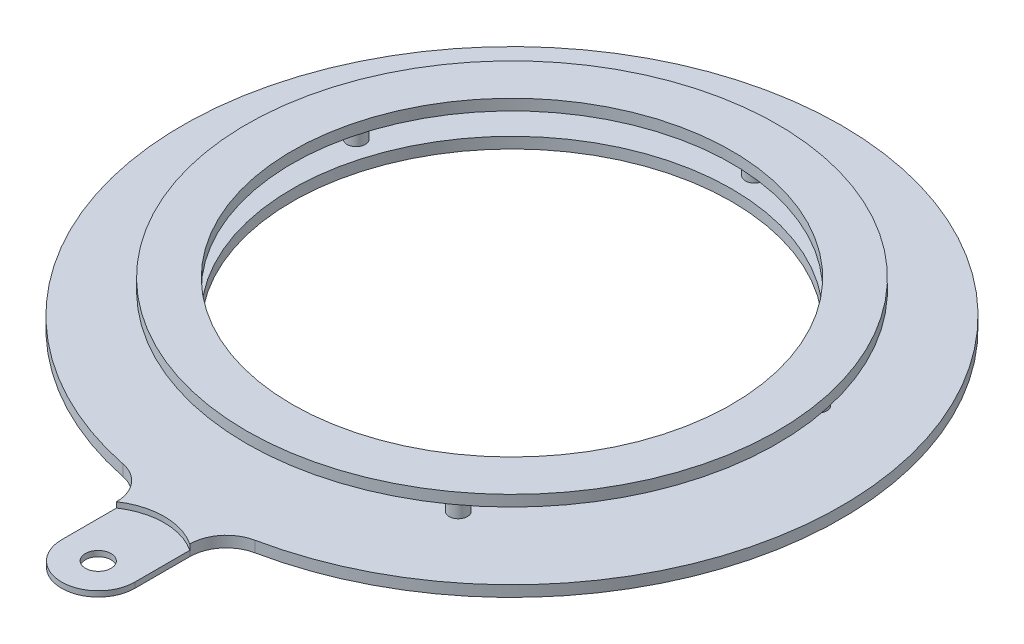
ISO-10303-21;
HEADER;
FILE_DESCRIPTION(('STEP AP214'),'2;1');
FILE_NAME('part.step','',(''),(''),'','','');
FILE_SCHEMA(('AUTOMOTIVE_DESIGN { 1 0 10303 214 1 1 1 1 }'));
ENDSEC;
DATA;
#1=APPLICATION_CONTEXT('core data for automotive mechanical design processes');
#2=APPLICATION_PROTOCOL_DEFINITION('international standard','automotive_design',2000,#1);
#3=PRODUCT_CONTEXT('',#1,'mechanical');
#4=PRODUCT('Part','Part','',(#3));
#5=PRODUCT_RELATED_PRODUCT_CATEGORY('part','',(#4));
#6=PRODUCT_DEFINITION_FORMATION('','',#4);
#7=PRODUCT_DEFINITION_CONTEXT('part definition',#1,'design');
#8=PRODUCT_DEFINITION('design','',#6,#7);
#9=PRODUCT_DEFINITION_SHAPE('','',#8);
#10=(LENGTH_UNIT() NAMED_UNIT(*) SI_UNIT(.MILLI.,.METRE.));
#11=(NAMED_UNIT(*) PLANE_ANGLE_UNIT() SI_UNIT($,.RADIAN.));
#12=(NAMED_UNIT(*) SI_UNIT($,.STERADIAN.) SOLID_ANGLE_UNIT());
#13=UNCERTAINTY_MEASURE_WITH_UNIT(LENGTH_MEASURE(1.E-05),#10,'distance_accuracy_value','');
#14=(GEOMETRIC_REPRESENTATION_CONTEXT(3) GLOBAL_UNCERTAINTY_ASSIGNED_CONTEXT((#13)) GLOBAL_UNIT_ASSIGNED_CONTEXT((#10,
#11,#12)) REPRESENTATION_CONTEXT('',''));
#15=CARTESIAN_POINT('',(0.,0.,0.));
#16=DIRECTION('',(0.,0.,1.));
#17=DIRECTION('',(1.,0.,0.));
#18=AXIS2_PLACEMENT_3D('',#15,#16,#17);
#19=CARTESIAN_POINT('',(0.,-9.,112.979589711327));
#20=DIRECTION('',(0.,1.,0.));
#21=DIRECTION('',(0.,0.,1.));
#22=AXIS2_PLACEMENT_3D('',#19,#20,#21);
#23=CYLINDRICAL_SURFACE('',#22,10.);
#24=CARTESIAN_POINT('',(0.,-7.5,112.979589711327));
#25=DIRECTION('',(0.,1.,0.));
#26=DIRECTION('',(0.,0.,1.));
#27=AXIS2_PLACEMENT_3D('',#24,#25,#26);
#28=CIRCLE('',#27,10.);
#29=CARTESIAN_POINT('',(-10.,-7.5,112.979589711327));
#30=VERTEX_POINT('',#29);
#31=CARTESIAN_POINT('',(10.,-7.5,112.979589711327));
#32=VERTEX_POINT('',#31);
#33=EDGE_CURVE('E55',#30,#32,#28,.T.);
#34=ORIENTED_EDGE('',*,*,#33,.F.);
#35=DIRECTION('',(0.,1.,0.));
#36=VECTOR('',#35,1.);
#37=CARTESIAN_POINT('',(-10.,-9.,112.979589711327));
#38=LINE('',#37,#36);
#39=CARTESIAN_POINT('',(-10.,-9.,112.979589711327));
#40=VERTEX_POINT('',#39);
#41=EDGE_CURVE('E139',#40,#30,#38,.T.);
#42=ORIENTED_EDGE('',*,*,#41,.F.);
#43=CARTESIAN_POINT('',(0.,-9.,112.979589711327));
#44=DIRECTION('',(0.,-1.,0.));
#45=DIRECTION('',(0.,0.,-1.));
#46=AXIS2_PLACEMENT_3D('',#43,#44,#45);
#47=CIRCLE('',#46,10.);
#48=CARTESIAN_POINT('',(10.,-9.,112.979589711327));
#49=VERTEX_POINT('',#48);
#50=EDGE_CURVE('E130',#49,#40,#47,.T.);
#51=ORIENTED_EDGE('',*,*,#50,.F.);
#52=DIRECTION('',(0.,1.,0.));
#53=VECTOR('',#52,1.);
#54=CARTESIAN_POINT('',(10.,-9.,112.979589711327));
#55=LINE('',#54,#53);
#56=EDGE_CURVE('E120',#49,#32,#55,.T.);
#57=ORIENTED_EDGE('',*,*,#56,.T.);
#58=EDGE_LOOP('',(#34,#42,#51,#57));
#59=FACE_BOUND('',#58,.T.);
#60=ADVANCED_FACE('F38',(#59),#23,.T.);
#61=CARTESIAN_POINT('',(-10.,-9.,112.979589711327));
#62=DIRECTION('',(1.,0.,0.));
#63=DIRECTION('',(0.,0.,-1.));
#64=AXIS2_PLACEMENT_3D('',#61,#62,#63);
#65=PLANE('',#64);
#66=DIRECTION('',(0.,0.,1.));
#67=VECTOR('',#66,1.);
#68=CARTESIAN_POINT('',(-10.,-7.5,112.979589711327));
#69=LINE('',#68,#67);
#70=CARTESIAN_POINT('',(-10.,-7.5,97.9795897113271));
#71=VERTEX_POINT('',#70);
#72=EDGE_CURVE('E269',#71,#30,#69,.T.);
#73=ORIENTED_EDGE('',*,*,#72,.F.);
#74=DIRECTION('',(0.,1.,0.));
#75=VECTOR('',#74,1.);
#76=CARTESIAN_POINT('',(-10.,-9.,97.9795897113271));
#77=LINE('',#76,#75);
#78=CARTESIAN_POINT('',(-10.,-9.,97.9795897113271));
#79=VERTEX_POINT('',#78);
#80=EDGE_CURVE('E136',#79,#71,#77,.T.);
#81=ORIENTED_EDGE('',*,*,#80,.F.);
#82=DIRECTION('',(0.,0.,-1.));
#83=VECTOR('',#82,1.);
#84=CARTESIAN_POINT('',(-10.,-9.,112.979589711327));
#85=LINE('',#84,#83);
#86=EDGE_CURVE('E89',#40,#79,#85,.T.);
#87=ORIENTED_EDGE('',*,*,#86,.F.);
#88=ORIENTED_EDGE('',*,*,#41,.T.);
#89=EDGE_LOOP('',(#73,#81,#87,#88));
#90=FACE_BOUND('',#89,.T.);
#91=ADVANCED_FACE('F202',(#90),#65,.F.);
#92=CARTESIAN_POINT('',(10.,-9.,112.979589711327));
#93=DIRECTION('',(-1.,0.,0.));
#94=DIRECTION('',(0.,0.,1.));
#95=AXIS2_PLACEMENT_3D('',#92,#93,#94);
#96=PLANE('',#95);
#97=DIRECTION('',(0.,0.,-1.));
#98=VECTOR('',#97,1.);
#99=CARTESIAN_POINT('',(10.,-7.5,112.979589711327));
#100=LINE('',#99,#98);
#101=CARTESIAN_POINT('',(10.,-7.5,97.9795897113271));
#102=VERTEX_POINT('',#101);
#103=EDGE_CURVE('E287',#32,#102,#100,.T.);
#104=ORIENTED_EDGE('',*,*,#103,.F.);
#105=ORIENTED_EDGE('',*,*,#56,.F.);
#106=DIRECTION('',(0.,0.,1.));
#107=VECTOR('',#106,1.);
#108=CARTESIAN_POINT('',(10.,-9.,112.979589711327));
#109=LINE('',#108,#107);
#110=CARTESIAN_POINT('',(10.,-9.,97.9795897113271));
#111=VERTEX_POINT('',#110);
#112=EDGE_CURVE('E64',#111,#49,#109,.T.);
#113=ORIENTED_EDGE('',*,*,#112,.F.);
#114=DIRECTION('',(0.,1.,0.));
#115=VECTOR('',#114,1.);
#116=CARTESIAN_POINT('',(10.,-9.,97.9795897113271));
#117=LINE('',#116,#115);
#118=EDGE_CURVE('E114',#111,#102,#117,.T.);
#119=ORIENTED_EDGE('',*,*,#118,.T.);
#120=EDGE_LOOP('',(#104,#105,#113,#119));
#121=FACE_BOUND('',#120,.T.);
#122=ADVANCED_FACE('F208',(#121),#96,.F.);
#123=CARTESIAN_POINT('',(0.,-10.,112.979589711327));
#124=DIRECTION('',(0.,1.,0.));
#125=DIRECTION('',(0.,0.,1.));
#126=AXIS2_PLACEMENT_3D('',#123,#124,#125);
#127=CYLINDRICAL_SURFACE('',#126,3.5);
#128=CARTESIAN_POINT('',(0.,-9.,112.979589711327));
#129=DIRECTION('',(0.,-1.,0.));
#130=DIRECTION('',(0.,0.,-1.));
#131=AXIS2_PLACEMENT_3D('',#128,#129,#130);
#132=CIRCLE('',#131,3.5);
#133=CARTESIAN_POINT('',(0.,-9.,109.479589711327));
#134=VERTEX_POINT('',#133);
#135=EDGE_CURVE('E256',#134,#134,#132,.T.);
#136=ORIENTED_EDGE('',*,*,#135,.T.);
#137=EDGE_LOOP('',(#136));
#138=FACE_BOUND('',#137,.T.);
#139=CARTESIAN_POINT('',(0.,-7.5,112.979589711327));
#140=DIRECTION('',(0.,1.,0.));
#141=DIRECTION('',(0.,0.,1.));
#142=AXIS2_PLACEMENT_3D('',#139,#140,#141);
#143=CIRCLE('',#142,3.5);
#144=CARTESIAN_POINT('',(0.,-7.5,116.479589711327));
#145=VERTEX_POINT('',#144);
#146=EDGE_CURVE('E42',#145,#145,#143,.F.);
#147=ORIENTED_EDGE('',*,*,#146,.F.);
#148=EDGE_LOOP('',(#147));
#149=FACE_BOUND('',#148,.T.);
#150=ADVANCED_FACE('F297',(#138,#149),#127,.F.);
#151=CARTESIAN_POINT('',(0.,3.,0.));
#152=DIRECTION('',(0.,1.,0.));
#153=DIRECTION('',(0.,0.,1.));
#154=AXIS2_PLACEMENT_3D('',#151,#152,#153);
#155=PLANE('',#154);
#156=CARTESIAN_POINT('',(0.,3.,0.));
#157=DIRECTION('',(0.,1.,0.));
#158=DIRECTION('',(0.,0.,1.));
#159=AXIS2_PLACEMENT_3D('',#156,#157,#158);
#160=CIRCLE('',#159,72.5);
#161=CARTESIAN_POINT('',(0.,3.,72.5));
#162=VERTEX_POINT('',#161);
#163=EDGE_CURVE('E11',#162,#162,#160,.T.);
#164=ORIENTED_EDGE('',*,*,#163,.T.);
#165=EDGE_LOOP('',(#164));
#166=FACE_BOUND('',#165,.T.);
#167=CARTESIAN_POINT('',(0.,3.,0.));
#168=DIRECTION('',(0.,1.,0.));
#169=DIRECTION('',(0.,0.,1.));
#170=AXIS2_PLACEMENT_3D('',#167,#168,#169);
#171=CIRCLE('',#170,60.);
#172=CARTESIAN_POINT('',(0.,3.,60.));
#173=VERTEX_POINT('',#172);
#174=EDGE_CURVE('E172',#173,#173,#171,.T.);
#175=ORIENTED_EDGE('',*,*,#174,.F.);
#176=EDGE_LOOP('',(#175));
#177=FACE_BOUND('',#176,.T.);
#178=ADVANCED_FACE('F183',(#166,#177),#155,.T.);
#179=CARTESIAN_POINT('',(0.,0.,0.));
#180=DIRECTION('',(0.,1.,0.));
#181=DIRECTION('',(0.,0.,1.));
#182=AXIS2_PLACEMENT_3D('',#179,#180,#181);
#183=PLANE('',#182);
#184=CARTESIAN_POINT('',(63.0074942045537,0.,-20.472375877341));
#185=DIRECTION('',(0.,1.,0.));
#186=DIRECTION('',(-0.95105651629515,0.,0.309016994374958));
#187=AXIS2_PLACEMENT_3D('',#184,#185,#186);
#188=CIRCLE('',#187,2.5);
#189=CARTESIAN_POINT('',(60.6298529138158,0.,-19.6998333914036));
#190=VERTEX_POINT('',#189);
#191=EDGE_CURVE('E145',#190,#190,#188,.T.);
#192=ORIENTED_EDGE('',*,*,#191,.T.);
#193=EDGE_LOOP('',(#192));
#194=FACE_BOUND('',#193,.T.);
#195=CARTESIAN_POINT('',(38.9407729643768,0.,53.5973758773399));
#196=DIRECTION('',(0.,1.,0.));
#197=DIRECTION('',(-0.58778525229248,0.,-0.809016994374942));
#198=AXIS2_PLACEMENT_3D('',#195,#196,#197);
#199=CIRCLE('',#198,2.5);
#200=CARTESIAN_POINT('',(37.4713098336456,0.,51.5748333914026));
#201=VERTEX_POINT('',#200);
#202=EDGE_CURVE('E148',#201,#201,#199,.T.);
#203=ORIENTED_EDGE('',*,*,#202,.T.);
#204=EDGE_LOOP('',(#203));
#205=FACE_BOUND('',#204,.T.);
#206=CARTESIAN_POINT('',(-38.940772964376,0.,53.5973758773405));
#207=DIRECTION('',(0.,1.,0.));
#208=DIRECTION('',(0.587785252292469,0.,-0.809016994374951));
#209=AXIS2_PLACEMENT_3D('',#206,#207,#208);
#210=CIRCLE('',#209,2.5);
#211=CARTESIAN_POINT('',(-37.4713098336449,0.,51.5748333914031));
#212=VERTEX_POINT('',#211);
#213=EDGE_CURVE('E155',#212,#212,#210,.T.);
#214=ORIENTED_EDGE('',*,*,#213,.T.);
#215=EDGE_LOOP('',(#214));
#216=FACE_BOUND('',#215,.T.);
#217=CARTESIAN_POINT('',(-63.007494204554,0.,-20.4723758773401));
#218=DIRECTION('',(0.,1.,0.));
#219=DIRECTION('',(0.951056516295155,0.,0.309016994374945));
#220=AXIS2_PLACEMENT_3D('',#217,#218,#219);
#221=CIRCLE('',#220,2.5);
#222=CARTESIAN_POINT('',(-60.6298529138161,0.,-19.6998333914027));
#223=VERTEX_POINT('',#222);
#224=EDGE_CURVE('E161',#223,#223,#221,.T.);
#225=ORIENTED_EDGE('',*,*,#224,.T.);
#226=EDGE_LOOP('',(#225));
#227=FACE_BOUND('',#226,.T.);
#228=CARTESIAN_POINT('',(0.,0.,-66.25));
#229=DIRECTION('',(0.,1.,0.));
#230=DIRECTION('',(0.,0.,1.));
#231=AXIS2_PLACEMENT_3D('',#228,#229,#230);
#232=CIRCLE('',#231,2.5);
#233=CARTESIAN_POINT('',(0.,0.,-63.75));
#234=VERTEX_POINT('',#233);
#235=EDGE_CURVE('E166',#234,#234,#232,.T.);
#236=ORIENTED_EDGE('',*,*,#235,.T.);
#237=EDGE_LOOP('',(#236));
#238=FACE_BOUND('',#237,.T.);
#239=CARTESIAN_POINT('',(0.,0.,0.));
#240=DIRECTION('',(0.,1.,0.));
#241=DIRECTION('',(0.,0.,1.));
#242=AXIS2_PLACEMENT_3D('',#239,#240,#241);
#243=CIRCLE('',#242,72.5);
#244=CARTESIAN_POINT('',(0.,0.,72.5));
#245=VERTEX_POINT('',#244);
#246=EDGE_CURVE('E47',#245,#245,#243,.T.);
#247=ORIENTED_EDGE('',*,*,#246,.F.);
#248=EDGE_LOOP('',(#247));
#249=FACE_BOUND('',#248,.T.);
#250=CARTESIAN_POINT('',(0.,0.,0.));
#251=DIRECTION('',(0.,1.,0.));
#252=DIRECTION('',(0.,0.,1.));
#253=AXIS2_PLACEMENT_3D('',#250,#251,#252);
#254=CIRCLE('',#253,60.);
#255=CARTESIAN_POINT('',(0.,0.,60.));
#256=VERTEX_POINT('',#255);
#257=EDGE_CURVE('E171',#256,#256,#254,.T.);
#258=ORIENTED_EDGE('',*,*,#257,.T.);
#259=EDGE_LOOP('',(#258));
#260=FACE_BOUND('',#259,.T.);
#261=ADVANCED_FACE('F180',(#194,#205,#216,#227,#238,#249,#260),#183,.F.);
#262=CARTESIAN_POINT('',(0.,3.,0.));
#263=DIRECTION('',(0.,-1.,0.));
#264=DIRECTION('',(0.,0.,-1.));
#265=AXIS2_PLACEMENT_3D('',#262,#263,#264);
#266=CYLINDRICAL_SURFACE('',#265,72.5);
#267=ORIENTED_EDGE('',*,*,#163,.F.);
#268=EDGE_LOOP('',(#267));
#269=FACE_BOUND('',#268,.T.);
#270=ORIENTED_EDGE('',*,*,#246,.T.);
#271=EDGE_LOOP('',(#270));
#272=FACE_BOUND('',#271,.T.);
#273=ADVANCED_FACE('F40',(#269,#272),#266,.T.);
#274=CARTESIAN_POINT('',(0.,3.,0.));
#275=DIRECTION('',(0.,-1.,0.));
#276=DIRECTION('',(0.,0.,-1.));
#277=AXIS2_PLACEMENT_3D('',#274,#275,#276);
#278=CYLINDRICAL_SURFACE('',#277,60.);
#279=ORIENTED_EDGE('',*,*,#174,.T.);
#280=EDGE_LOOP('',(#279));
#281=FACE_BOUND('',#280,.T.);
#282=ORIENTED_EDGE('',*,*,#257,.F.);
#283=EDGE_LOOP('',(#282));
#284=FACE_BOUND('',#283,.T.);
#285=ADVANCED_FACE('F187',(#281,#284),#278,.F.);
#286=CARTESIAN_POINT('',(0.,-6.,-66.25));
#287=DIRECTION('',(0.,1.,0.));
#288=DIRECTION('',(0.,0.,1.));
#289=AXIS2_PLACEMENT_3D('',#286,#287,#288);
#290=CYLINDRICAL_SURFACE('',#289,2.5);
#291=CARTESIAN_POINT('',(0.,-6.,-66.25));
#292=DIRECTION('',(0.,1.,0.));
#293=DIRECTION('',(0.,0.,1.));
#294=AXIS2_PLACEMENT_3D('',#291,#292,#293);
#295=CIRCLE('',#294,2.5);
#296=CARTESIAN_POINT('',(0.,-6.,-63.75));
#297=VERTEX_POINT('',#296);
#298=EDGE_CURVE('E149',#297,#297,#295,.T.);
#299=ORIENTED_EDGE('',*,*,#298,.T.);
#300=EDGE_LOOP('',(#299));
#301=FACE_BOUND('',#300,.T.);
#302=ORIENTED_EDGE('',*,*,#235,.F.);
#303=EDGE_LOOP('',(#302));
#304=FACE_BOUND('',#303,.T.);
#305=ADVANCED_FACE('F189',(#301,#304),#290,.T.);
#306=CARTESIAN_POINT('',(-63.007494204554,-6.,-20.4723758773401));
#307=DIRECTION('',(0.,1.,0.));
#308=DIRECTION('',(0.,0.,1.));
#309=AXIS2_PLACEMENT_3D('',#306,#307,#308);
#310=CYLINDRICAL_SURFACE('',#309,2.5);
#311=CARTESIAN_POINT('',(-63.007494204554,-6.,-20.4723758773401));
#312=DIRECTION('',(0.,1.,0.));
#313=DIRECTION('',(0.951056516295155,0.,0.309016994374945));
#314=AXIS2_PLACEMENT_3D('',#311,#312,#313);
#315=CIRCLE('',#314,2.5);
#316=CARTESIAN_POINT('',(-60.6298529138161,-6.,-19.6998333914027));
#317=VERTEX_POINT('',#316);
#318=EDGE_CURVE('E158',#317,#317,#315,.T.);
#319=ORIENTED_EDGE('',*,*,#318,.T.);
#320=EDGE_LOOP('',(#319));
#321=FACE_BOUND('',#320,.T.);
#322=ORIENTED_EDGE('',*,*,#224,.F.);
#323=EDGE_LOOP('',(#322));
#324=FACE_BOUND('',#323,.T.);
#325=ADVANCED_FACE('F196',(#321,#324),#310,.T.);
#326=CARTESIAN_POINT('',(-38.940772964376,-6.,53.5973758773405));
#327=DIRECTION('',(0.,1.,0.));
#328=DIRECTION('',(0.,0.,1.));
#329=AXIS2_PLACEMENT_3D('',#326,#327,#328);
#330=CYLINDRICAL_SURFACE('',#329,2.5);
#331=CARTESIAN_POINT('',(-38.940772964376,-6.,53.5973758773405));
#332=DIRECTION('',(0.,1.,0.));
#333=DIRECTION('',(0.587785252292469,0.,-0.809016994374951));
#334=AXIS2_PLACEMENT_3D('',#331,#332,#333);
#335=CIRCLE('',#334,2.5);
#336=CARTESIAN_POINT('',(-37.4713098336449,-6.,51.5748333914031));
#337=VERTEX_POINT('',#336);
#338=EDGE_CURVE('E152',#337,#337,#335,.T.);
#339=ORIENTED_EDGE('',*,*,#338,.T.);
#340=EDGE_LOOP('',(#339));
#341=FACE_BOUND('',#340,.T.);
#342=ORIENTED_EDGE('',*,*,#213,.F.);
#343=EDGE_LOOP('',(#342));
#344=FACE_BOUND('',#343,.T.);
#345=ADVANCED_FACE('F219',(#341,#344),#330,.T.);
#346=CARTESIAN_POINT('',(38.9407729643768,-6.,53.5973758773399));
#347=DIRECTION('',(0.,1.,0.));
#348=DIRECTION('',(0.,0.,1.));
#349=AXIS2_PLACEMENT_3D('',#346,#347,#348);
#350=CYLINDRICAL_SURFACE('',#349,2.5);
#351=CARTESIAN_POINT('',(38.9407729643768,-6.,53.5973758773399));
#352=DIRECTION('',(0.,1.,0.));
#353=DIRECTION('',(-0.58778525229248,0.,-0.809016994374942));
#354=AXIS2_PLACEMENT_3D('',#351,#352,#353);
#355=CIRCLE('',#354,2.5);
#356=CARTESIAN_POINT('',(37.4713098336456,-6.,51.5748333914026));
#357=VERTEX_POINT('',#356);
#358=EDGE_CURVE('E144',#357,#357,#355,.T.);
#359=ORIENTED_EDGE('',*,*,#358,.T.);
#360=EDGE_LOOP('',(#359));
#361=FACE_BOUND('',#360,.T.);
#362=ORIENTED_EDGE('',*,*,#202,.F.);
#363=EDGE_LOOP('',(#362));
#364=FACE_BOUND('',#363,.T.);
#365=ADVANCED_FACE('F215',(#361,#364),#350,.T.);
#366=CARTESIAN_POINT('',(63.0074942045537,-6.,-20.472375877341));
#367=DIRECTION('',(0.,1.,0.));
#368=DIRECTION('',(0.,0.,1.));
#369=AXIS2_PLACEMENT_3D('',#366,#367,#368);
#370=CYLINDRICAL_SURFACE('',#369,2.5);
#371=CARTESIAN_POINT('',(63.0074942045537,-6.,-20.472375877341));
#372=DIRECTION('',(0.,1.,0.));
#373=DIRECTION('',(-0.95105651629515,0.,0.309016994374958));
#374=AXIS2_PLACEMENT_3D('',#371,#372,#373);
#375=CIRCLE('',#374,2.5);
#376=CARTESIAN_POINT('',(60.6298529138158,-6.,-19.6998333914036));
#377=VERTEX_POINT('',#376);
#378=EDGE_CURVE('E141',#377,#377,#375,.T.);
#379=ORIENTED_EDGE('',*,*,#378,.T.);
#380=EDGE_LOOP('',(#379));
#381=FACE_BOUND('',#380,.T.);
#382=ORIENTED_EDGE('',*,*,#191,.F.);
#383=EDGE_LOOP('',(#382));
#384=FACE_BOUND('',#383,.T.);
#385=ADVANCED_FACE('F212',(#381,#384),#370,.T.);
#386=CARTESIAN_POINT('',(0.,-9.,112.979589711327));
#387=DIRECTION('',(0.,-1.,0.));
#388=DIRECTION('',(0.,0.,-1.));
#389=AXIS2_PLACEMENT_3D('',#386,#387,#388);
#390=PLANE('',#389);
#391=ORIENTED_EDGE('',*,*,#135,.F.);
#392=EDGE_LOOP('',(#391));
#393=FACE_BOUND('',#392,.T.);
#394=ORIENTED_EDGE('',*,*,#50,.T.);
#395=ORIENTED_EDGE('',*,*,#86,.T.);
#396=CARTESIAN_POINT('',(-20.,-9.,97.9795897113271));
#397=DIRECTION('',(0.,1.,0.));
#398=DIRECTION('',(0.,0.,1.));
#399=AXIS2_PLACEMENT_3D('',#396,#397,#398);
#400=CIRCLE('',#399,9.99999999999999);
#401=CARTESIAN_POINT('',(-18.,-9.,88.1816307401944));
#402=VERTEX_POINT('',#401);
#403=EDGE_CURVE('E105',#79,#402,#400,.T.);
#404=ORIENTED_EDGE('',*,*,#403,.T.);
#405=CARTESIAN_POINT('',(0.,-9.,0.));
#406=DIRECTION('',(0.,-1.,0.));
#407=DIRECTION('',(0.,0.,-1.));
#408=AXIS2_PLACEMENT_3D('',#405,#406,#407);
#409=CIRCLE('',#408,90.);
#410=CARTESIAN_POINT('',(18.,-9.,88.1816307401944));
#411=VERTEX_POINT('',#410);
#412=EDGE_CURVE('E98',#402,#411,#409,.T.);
#413=ORIENTED_EDGE('',*,*,#412,.T.);
#414=CARTESIAN_POINT('',(20.,-9.,97.9795897113271));
#415=DIRECTION('',(0.,1.,0.));
#416=DIRECTION('',(0.,0.,-1.));
#417=AXIS2_PLACEMENT_3D('',#414,#415,#416);
#418=CIRCLE('',#417,9.99999999999999);
#419=EDGE_CURVE('E102',#411,#111,#418,.T.);
#420=ORIENTED_EDGE('',*,*,#419,.T.);
#421=ORIENTED_EDGE('',*,*,#112,.T.);
#422=EDGE_LOOP('',(#394,#395,#404,#413,#420,#421));
#423=FACE_BOUND('',#422,.T.);
#424=CARTESIAN_POINT('',(0.,-9.,0.));
#425=DIRECTION('',(0.,-1.,0.));
#426=DIRECTION('',(0.,0.,-1.));
#427=AXIS2_PLACEMENT_3D('',#424,#425,#426);
#428=CIRCLE('',#427,60.);
#429=CARTESIAN_POINT('',(0.,-9.,-60.));
#430=VERTEX_POINT('',#429);
#431=EDGE_CURVE('E126',#430,#430,#428,.T.);
#432=ORIENTED_EDGE('',*,*,#431,.F.);
#433=EDGE_LOOP('',(#432));
#434=FACE_BOUND('',#433,.T.);
#435=ADVANCED_FACE('F99',(#393,#423,#434),#390,.T.);
#436=CARTESIAN_POINT('',(0.,-6.,112.979589711327));
#437=DIRECTION('',(0.,-1.,0.));
#438=DIRECTION('',(0.,0.,-1.));
#439=AXIS2_PLACEMENT_3D('',#436,#437,#438);
#440=PLANE('',#439);
#441=ORIENTED_EDGE('',*,*,#298,.F.);
#442=EDGE_LOOP('',(#441));
#443=FACE_BOUND('',#442,.T.);
#444=ORIENTED_EDGE('',*,*,#318,.F.);
#445=EDGE_LOOP('',(#444));
#446=FACE_BOUND('',#445,.T.);
#447=ORIENTED_EDGE('',*,*,#338,.F.);
#448=EDGE_LOOP('',(#447));
#449=FACE_BOUND('',#448,.T.);
#450=ORIENTED_EDGE('',*,*,#358,.F.);
#451=EDGE_LOOP('',(#450));
#452=FACE_BOUND('',#451,.T.);
#453=ORIENTED_EDGE('',*,*,#378,.F.);
#454=EDGE_LOOP('',(#453));
#455=FACE_BOUND('',#454,.T.);
#456=CARTESIAN_POINT('',(-20.,-6.,97.9795897113271));
#457=DIRECTION('',(0.,1.,0.));
#458=DIRECTION('',(0.,0.,1.));
#459=AXIS2_PLACEMENT_3D('',#456,#457,#458);
#460=CIRCLE('',#459,9.99999999999999);
#461=CARTESIAN_POINT('',(-10.,-6.,97.9795897113271));
#462=VERTEX_POINT('',#461);
#463=CARTESIAN_POINT('',(-18.,-6.,88.1816307401944));
#464=VERTEX_POINT('',#463);
#465=EDGE_CURVE('E124',#462,#464,#460,.T.);
#466=ORIENTED_EDGE('',*,*,#465,.F.);
#467=CARTESIAN_POINT('',(0.,-6.,112.979589711327));
#468=DIRECTION('',(0.,1.,0.));
#469=DIRECTION('',(0.,0.,1.));
#470=AXIS2_PLACEMENT_3D('',#467,#468,#469);
#471=CIRCLE('',#470,18.02775637732);
#472=CARTESIAN_POINT('',(10.,-6.,97.9795897113271));
#473=VERTEX_POINT('',#472);
#474=EDGE_CURVE('E274',#473,#462,#471,.T.);
#475=ORIENTED_EDGE('',*,*,#474,.F.);
#476=CARTESIAN_POINT('',(20.,-6.,97.9795897113271));
#477=DIRECTION('',(0.,1.,0.));
#478=DIRECTION('',(0.,0.,-1.));
#479=AXIS2_PLACEMENT_3D('',#476,#477,#478);
#480=CIRCLE('',#479,9.99999999999999);
#481=CARTESIAN_POINT('',(18.,-6.,88.1816307401944));
#482=VERTEX_POINT('',#481);
#483=EDGE_CURVE('E128',#482,#473,#480,.T.);
#484=ORIENTED_EDGE('',*,*,#483,.F.);
#485=CARTESIAN_POINT('',(0.,-6.,0.));
#486=DIRECTION('',(0.,-1.,0.));
#487=DIRECTION('',(0.,0.,-1.));
#488=AXIS2_PLACEMENT_3D('',#485,#486,#487);
#489=CIRCLE('',#488,90.);
#490=EDGE_CURVE('E80',#464,#482,#489,.T.);
#491=ORIENTED_EDGE('',*,*,#490,.F.);
#492=EDGE_LOOP('',(#466,#475,#484,#491));
#493=FACE_BOUND('',#492,.T.);
#494=CARTESIAN_POINT('',(0.,-6.,0.));
#495=DIRECTION('',(0.,-1.,0.));
#496=DIRECTION('',(0.,0.,-1.));
#497=AXIS2_PLACEMENT_3D('',#494,#495,#496);
#498=CIRCLE('',#497,60.);
#499=CARTESIAN_POINT('',(0.,-6.,-60.));
#500=VERTEX_POINT('',#499);
#501=EDGE_CURVE('E254',#500,#500,#498,.T.);
#502=ORIENTED_EDGE('',*,*,#501,.T.);
#503=EDGE_LOOP('',(#502));
#504=FACE_BOUND('',#503,.T.);
#505=ADVANCED_FACE('F236',(#443,#446,#449,#452,#455,#493,#504),#440,.F.);
#506=CARTESIAN_POINT('',(-20.,-9.,97.9795897113271));
#507=DIRECTION('',(0.,1.,0.));
#508=DIRECTION('',(0.,0.,1.));
#509=AXIS2_PLACEMENT_3D('',#506,#507,#508);
#510=CYLINDRICAL_SURFACE('',#509,9.99999999999999);
#511=ORIENTED_EDGE('',*,*,#465,.T.);
#512=DIRECTION('',(0.,1.,0.));
#513=VECTOR('',#512,1.);
#514=CARTESIAN_POINT('',(-18.,-9.,88.1816307401944));
#515=LINE('',#514,#513);
#516=EDGE_CURVE('E113',#402,#464,#515,.T.);
#517=ORIENTED_EDGE('',*,*,#516,.F.);
#518=ORIENTED_EDGE('',*,*,#403,.F.);
#519=ORIENTED_EDGE('',*,*,#80,.T.);
#520=DIRECTION('',(0.,1.,0.));
#521=VECTOR('',#520,1.);
#522=CARTESIAN_POINT('',(-10.,-6.75,97.9795897113271));
#523=LINE('',#522,#521);
#524=EDGE_CURVE('E261',#71,#462,#523,.T.);
#525=ORIENTED_EDGE('',*,*,#524,.T.);
#526=EDGE_LOOP('',(#511,#517,#518,#519,#525));
#527=FACE_BOUND('',#526,.T.);
#528=ADVANCED_FACE('F239',(#527),#510,.F.);
#529=CARTESIAN_POINT('',(0.,-9.,0.));
#530=DIRECTION('',(0.,1.,0.));
#531=DIRECTION('',(0.,0.,1.));
#532=AXIS2_PLACEMENT_3D('',#529,#530,#531);
#533=CYLINDRICAL_SURFACE('',#532,90.);
#534=ORIENTED_EDGE('',*,*,#490,.T.);
#535=DIRECTION('',(0.,1.,0.));
#536=VECTOR('',#535,1.);
#537=CARTESIAN_POINT('',(18.,-9.,88.1816307401944));
#538=LINE('',#537,#536);
#539=EDGE_CURVE('E108',#411,#482,#538,.T.);
#540=ORIENTED_EDGE('',*,*,#539,.F.);
#541=ORIENTED_EDGE('',*,*,#412,.F.);
#542=ORIENTED_EDGE('',*,*,#516,.T.);
#543=EDGE_LOOP('',(#534,#540,#541,#542));
#544=FACE_BOUND('',#543,.T.);
#545=ADVANCED_FACE('F109',(#544),#533,.T.);
#546=CARTESIAN_POINT('',(20.,-9.,97.9795897113271));
#547=DIRECTION('',(0.,1.,0.));
#548=DIRECTION('',(0.,0.,1.));
#549=AXIS2_PLACEMENT_3D('',#546,#547,#548);
#550=CYLINDRICAL_SURFACE('',#549,9.99999999999999);
#551=ORIENTED_EDGE('',*,*,#483,.T.);
#552=EDGE_CURVE('E133',#102,#473,#117,.T.);
#553=ORIENTED_EDGE('',*,*,#552,.F.);
#554=ORIENTED_EDGE('',*,*,#118,.F.);
#555=ORIENTED_EDGE('',*,*,#419,.F.);
#556=ORIENTED_EDGE('',*,*,#539,.T.);
#557=EDGE_LOOP('',(#551,#553,#554,#555,#556));
#558=FACE_BOUND('',#557,.T.);
#559=ADVANCED_FACE('F116',(#558),#550,.F.);
#560=CARTESIAN_POINT('',(0.,-9.,0.));
#561=DIRECTION('',(0.,1.,0.));
#562=DIRECTION('',(0.,0.,1.));
#563=AXIS2_PLACEMENT_3D('',#560,#561,#562);
#564=CYLINDRICAL_SURFACE('',#563,60.);
#565=ORIENTED_EDGE('',*,*,#431,.T.);
#566=EDGE_LOOP('',(#565));
#567=FACE_BOUND('',#566,.T.);
#568=ORIENTED_EDGE('',*,*,#501,.F.);
#569=EDGE_LOOP('',(#568));
#570=FACE_BOUND('',#569,.T.);
#571=ADVANCED_FACE('F312',(#567,#570),#564,.F.);
#572=CARTESIAN_POINT('',(0.,-7.5,112.979589711327));
#573=DIRECTION('',(0.,1.,0.));
#574=DIRECTION('',(0.,0.,1.));
#575=AXIS2_PLACEMENT_3D('',#572,#573,#574);
#576=CYLINDRICAL_SURFACE('',#575,18.02775637732);
#577=CARTESIAN_POINT('',(0.,-7.5,112.979589711327));
#578=DIRECTION('',(0.,1.,0.));
#579=DIRECTION('',(0.,0.,1.));
#580=AXIS2_PLACEMENT_3D('',#577,#578,#579);
#581=CIRCLE('',#580,18.02775637732);
#582=EDGE_CURVE('E285',#102,#71,#581,.T.);
#583=ORIENTED_EDGE('',*,*,#582,.F.);
#584=ORIENTED_EDGE('',*,*,#552,.T.);
#585=ORIENTED_EDGE('',*,*,#474,.T.);
#586=ORIENTED_EDGE('',*,*,#524,.F.);
#587=EDGE_LOOP('',(#583,#584,#585,#586));
#588=FACE_BOUND('',#587,.T.);
#589=ADVANCED_FACE('F310',(#588),#576,.F.);
#590=CARTESIAN_POINT('',(0.,-7.5,112.979589711327));
#591=DIRECTION('',(0.,1.,0.));
#592=DIRECTION('',(0.,0.,1.));
#593=AXIS2_PLACEMENT_3D('',#590,#591,#592);
#594=PLANE('',#593);
#595=ORIENTED_EDGE('',*,*,#146,.T.);
#596=EDGE_LOOP('',(#595));
#597=FACE_BOUND('',#596,.T.);
#598=ORIENTED_EDGE('',*,*,#72,.T.);
#599=ORIENTED_EDGE('',*,*,#33,.T.);
#600=ORIENTED_EDGE('',*,*,#103,.T.);
#601=ORIENTED_EDGE('',*,*,#582,.T.);
#602=EDGE_LOOP('',(#598,#599,#600,#601));
#603=FACE_BOUND('',#602,.T.);
#604=ADVANCED_FACE('F284',(#597,#603),#594,.T.);
#605=CLOSED_SHELL('',(#60,#91,#122,#150,#178,#261,#273,#285,#305,#325,#345,#365,#385,#435,#505,
#528,#545,#559,#571,#589,#604));
#606=MANIFOLD_SOLID_BREP('B2',#605);
#607=ADVANCED_BREP_SHAPE_REPRESENTATION('',(#18,#606),#14);
#608=SHAPE_DEFINITION_REPRESENTATION(#9,#607);
ENDSEC;
END-ISO-10303-21;
